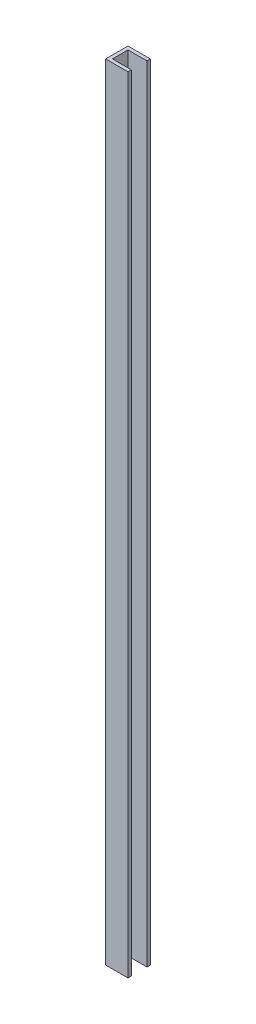
ISO-10303-21;
HEADER;
FILE_DESCRIPTION(('STEP AP214'),'2;1');
FILE_NAME('part.step','',(''),(''),'','','');
FILE_SCHEMA(('AUTOMOTIVE_DESIGN { 1 0 10303 214 1 1 1 1 }'));
ENDSEC;
DATA;
#1=APPLICATION_CONTEXT('core data for automotive mechanical design processes');
#2=APPLICATION_PROTOCOL_DEFINITION('international standard','automotive_design',2000,#1);
#3=PRODUCT_CONTEXT('',#1,'mechanical');
#4=PRODUCT('Part','Part','',(#3));
#5=PRODUCT_RELATED_PRODUCT_CATEGORY('part','',(#4));
#6=PRODUCT_DEFINITION_FORMATION('','',#4);
#7=PRODUCT_DEFINITION_CONTEXT('part definition',#1,'design');
#8=PRODUCT_DEFINITION('design','',#6,#7);
#9=PRODUCT_DEFINITION_SHAPE('','',#8);
#10=(LENGTH_UNIT() NAMED_UNIT(*) SI_UNIT(.MILLI.,.METRE.));
#11=(NAMED_UNIT(*) PLANE_ANGLE_UNIT() SI_UNIT($,.RADIAN.));
#12=(NAMED_UNIT(*) SI_UNIT($,.STERADIAN.) SOLID_ANGLE_UNIT());
#13=UNCERTAINTY_MEASURE_WITH_UNIT(LENGTH_MEASURE(1.E-05),#10,'distance_accuracy_value','');
#14=(GEOMETRIC_REPRESENTATION_CONTEXT(3) GLOBAL_UNCERTAINTY_ASSIGNED_CONTEXT((#13)) GLOBAL_UNIT_ASSIGNED_CONTEXT((#10,
#11,#12)) REPRESENTATION_CONTEXT('',''));
#15=CARTESIAN_POINT('',(0.,0.,0.));
#16=DIRECTION('',(0.,0.,1.));
#17=DIRECTION('',(1.,0.,0.));
#18=AXIS2_PLACEMENT_3D('',#15,#16,#17);
#19=CARTESIAN_POINT('',(-3.5,176.,0.));
#20=DIRECTION('',(1.,0.,0.));
#21=DIRECTION('',(0.,0.,-1.));
#22=AXIS2_PLACEMENT_3D('',#19,#20,#21);
#23=PLANE('',#22);
#24=DIRECTION('',(0.,0.,1.));
#25=VECTOR('',#24,1.);
#26=CARTESIAN_POINT('',(-3.5,-176.,0.));
#27=LINE('',#26,#25);
#28=CARTESIAN_POINT('',(-3.5,-176.,-3.50000000000002));
#29=VERTEX_POINT('',#28);
#30=CARTESIAN_POINT('',(-3.5,-176.,3.50000000000001));
#31=VERTEX_POINT('',#30);
#32=EDGE_CURVE('E197',#29,#31,#27,.T.);
#33=ORIENTED_EDGE('',*,*,#32,.F.);
#34=DIRECTION('',(0.,-1.,0.));
#35=VECTOR('',#34,1.);
#36=CARTESIAN_POINT('',(-3.5,176.,-3.50000000000002));
#37=LINE('',#36,#35);
#38=CARTESIAN_POINT('',(-3.5,176.,-3.50000000000002));
#39=VERTEX_POINT('',#38);
#40=EDGE_CURVE('E11',#39,#29,#37,.T.);
#41=ORIENTED_EDGE('',*,*,#40,.F.);
#42=DIRECTION('',(0.,0.,1.));
#43=VECTOR('',#42,1.);
#44=CARTESIAN_POINT('',(-3.5,176.,0.));
#45=LINE('',#44,#43);
#46=CARTESIAN_POINT('',(-3.5,176.,3.50000000000001));
#47=VERTEX_POINT('',#46);
#48=EDGE_CURVE('E153',#39,#47,#45,.T.);
#49=ORIENTED_EDGE('',*,*,#48,.T.);
#50=DIRECTION('',(0.,-1.,0.));
#51=VECTOR('',#50,1.);
#52=CARTESIAN_POINT('',(-3.5,176.,3.50000000000001));
#53=LINE('',#52,#51);
#54=EDGE_CURVE('E97',#47,#31,#53,.T.);
#55=ORIENTED_EDGE('',*,*,#54,.T.);
#56=EDGE_LOOP('',(#33,#41,#49,#55));
#57=FACE_BOUND('',#56,.T.);
#58=ADVANCED_FACE('F45',(#57),#23,.T.);
#59=CARTESIAN_POINT('',(0.,176.,-3.50000000000002));
#60=DIRECTION('',(0.,0.,1.));
#61=DIRECTION('',(1.,0.,0.));
#62=AXIS2_PLACEMENT_3D('',#59,#60,#61);
#63=PLANE('',#62);
#64=DIRECTION('',(-1.,0.,0.));
#65=VECTOR('',#64,1.);
#66=CARTESIAN_POINT('',(0.,-176.,-3.50000000000002));
#67=LINE('',#66,#65);
#68=CARTESIAN_POINT('',(5.,-176.,-3.50000000000002));
#69=VERTEX_POINT('',#68);
#70=EDGE_CURVE('E190',#69,#29,#67,.T.);
#71=ORIENTED_EDGE('',*,*,#70,.F.);
#72=DIRECTION('',(0.,-1.,0.));
#73=VECTOR('',#72,1.);
#74=CARTESIAN_POINT('',(5.,176.,-3.50000000000002));
#75=LINE('',#74,#73);
#76=CARTESIAN_POINT('',(5.,176.,-3.50000000000002));
#77=VERTEX_POINT('',#76);
#78=EDGE_CURVE('E54',#77,#69,#75,.T.);
#79=ORIENTED_EDGE('',*,*,#78,.F.);
#80=DIRECTION('',(-1.,0.,0.));
#81=VECTOR('',#80,1.);
#82=CARTESIAN_POINT('',(0.,176.,-3.50000000000002));
#83=LINE('',#82,#81);
#84=EDGE_CURVE('E145',#77,#39,#83,.T.);
#85=ORIENTED_EDGE('',*,*,#84,.T.);
#86=ORIENTED_EDGE('',*,*,#40,.T.);
#87=EDGE_LOOP('',(#71,#79,#85,#86));
#88=FACE_BOUND('',#87,.T.);
#89=ADVANCED_FACE('F195',(#88),#63,.T.);
#90=CARTESIAN_POINT('',(5.,176.,0.));
#91=DIRECTION('',(-1.,0.,0.));
#92=DIRECTION('',(0.,0.,1.));
#93=AXIS2_PLACEMENT_3D('',#90,#91,#92);
#94=PLANE('',#93);
#95=DIRECTION('',(0.,0.,-1.));
#96=VECTOR('',#95,1.);
#97=CARTESIAN_POINT('',(5.,-176.,0.));
#98=LINE('',#97,#96);
#99=CARTESIAN_POINT('',(5.,-176.,-5.00000000000002));
#100=VERTEX_POINT('',#99);
#101=EDGE_CURVE('E165',#69,#100,#98,.T.);
#102=ORIENTED_EDGE('',*,*,#101,.T.);
#103=DIRECTION('',(0.,-1.,0.));
#104=VECTOR('',#103,1.);
#105=CARTESIAN_POINT('',(5.,176.,-5.00000000000002));
#106=LINE('',#105,#104);
#107=CARTESIAN_POINT('',(5.,176.,-5.00000000000002));
#108=VERTEX_POINT('',#107);
#109=EDGE_CURVE('E178',#108,#100,#106,.T.);
#110=ORIENTED_EDGE('',*,*,#109,.F.);
#111=DIRECTION('',(0.,0.,-1.));
#112=VECTOR('',#111,1.);
#113=CARTESIAN_POINT('',(5.,176.,0.));
#114=LINE('',#113,#112);
#115=EDGE_CURVE('E138',#77,#108,#114,.T.);
#116=ORIENTED_EDGE('',*,*,#115,.F.);
#117=ORIENTED_EDGE('',*,*,#78,.T.);
#118=EDGE_LOOP('',(#102,#110,#116,#117));
#119=FACE_BOUND('',#118,.T.);
#120=ADVANCED_FACE('F184',(#119),#94,.F.);
#121=CARTESIAN_POINT('',(0.,176.,-5.00000000000002));
#122=DIRECTION('',(0.,0.,-1.));
#123=DIRECTION('',(-1.,0.,0.));
#124=AXIS2_PLACEMENT_3D('',#121,#122,#123);
#125=PLANE('',#124);
#126=DIRECTION('',(1.,0.,0.));
#127=VECTOR('',#126,1.);
#128=CARTESIAN_POINT('',(0.,-176.,-5.00000000000002));
#129=LINE('',#128,#127);
#130=CARTESIAN_POINT('',(-5.,-176.,-5.00000000000002));
#131=VERTEX_POINT('',#130);
#132=EDGE_CURVE('E193',#131,#100,#129,.T.);
#133=ORIENTED_EDGE('',*,*,#132,.F.);
#134=DIRECTION('',(0.,-1.,0.));
#135=VECTOR('',#134,1.);
#136=CARTESIAN_POINT('',(-5.,176.,-5.00000000000002));
#137=LINE('',#136,#135);
#138=CARTESIAN_POINT('',(-5.,176.,-5.00000000000002));
#139=VERTEX_POINT('',#138);
#140=EDGE_CURVE('E175',#139,#131,#137,.T.);
#141=ORIENTED_EDGE('',*,*,#140,.F.);
#142=DIRECTION('',(1.,0.,0.));
#143=VECTOR('',#142,1.);
#144=CARTESIAN_POINT('',(0.,176.,-5.00000000000002));
#145=LINE('',#144,#143);
#146=EDGE_CURVE('E144',#139,#108,#145,.T.);
#147=ORIENTED_EDGE('',*,*,#146,.T.);
#148=ORIENTED_EDGE('',*,*,#109,.T.);
#149=EDGE_LOOP('',(#133,#141,#147,#148));
#150=FACE_BOUND('',#149,.T.);
#151=ADVANCED_FACE('F210',(#150),#125,.T.);
#152=CARTESIAN_POINT('',(-5.,176.,0.));
#153=DIRECTION('',(-1.,0.,0.));
#154=DIRECTION('',(0.,0.,1.));
#155=AXIS2_PLACEMENT_3D('',#152,#153,#154);
#156=PLANE('',#155);
#157=DIRECTION('',(0.,0.,-1.));
#158=VECTOR('',#157,1.);
#159=CARTESIAN_POINT('',(-5.,-176.,0.));
#160=LINE('',#159,#158);
#161=CARTESIAN_POINT('',(-5.,-176.,5.00000000000002));
#162=VERTEX_POINT('',#161);
#163=EDGE_CURVE('E203',#162,#131,#160,.T.);
#164=ORIENTED_EDGE('',*,*,#163,.F.);
#165=DIRECTION('',(0.,-1.,0.));
#166=VECTOR('',#165,1.);
#167=CARTESIAN_POINT('',(-5.,176.,5.00000000000002));
#168=LINE('',#167,#166);
#169=CARTESIAN_POINT('',(-5.,176.,5.00000000000002));
#170=VERTEX_POINT('',#169);
#171=EDGE_CURVE('E132',#170,#162,#168,.T.);
#172=ORIENTED_EDGE('',*,*,#171,.F.);
#173=DIRECTION('',(0.,0.,-1.));
#174=VECTOR('',#173,1.);
#175=CARTESIAN_POINT('',(-5.,176.,0.));
#176=LINE('',#175,#174);
#177=EDGE_CURVE('E123',#170,#139,#176,.T.);
#178=ORIENTED_EDGE('',*,*,#177,.T.);
#179=ORIENTED_EDGE('',*,*,#140,.T.);
#180=EDGE_LOOP('',(#164,#172,#178,#179));
#181=FACE_BOUND('',#180,.T.);
#182=ADVANCED_FACE('F208',(#181),#156,.T.);
#183=CARTESIAN_POINT('',(0.,176.,5.00000000000002));
#184=DIRECTION('',(0.,0.,-1.));
#185=DIRECTION('',(-1.,0.,0.));
#186=AXIS2_PLACEMENT_3D('',#183,#184,#185);
#187=PLANE('',#186);
#188=DIRECTION('',(1.,0.,0.));
#189=VECTOR('',#188,1.);
#190=CARTESIAN_POINT('',(0.,-176.,5.00000000000002));
#191=LINE('',#190,#189);
#192=CARTESIAN_POINT('',(5.,-176.,5.00000000000002));
#193=VERTEX_POINT('',#192);
#194=EDGE_CURVE('E130',#162,#193,#191,.T.);
#195=ORIENTED_EDGE('',*,*,#194,.T.);
#196=DIRECTION('',(0.,-1.,0.));
#197=VECTOR('',#196,1.);
#198=CARTESIAN_POINT('',(5.,176.,5.00000000000002));
#199=LINE('',#198,#197);
#200=CARTESIAN_POINT('',(5.,176.,5.00000000000002));
#201=VERTEX_POINT('',#200);
#202=EDGE_CURVE('E127',#201,#193,#199,.T.);
#203=ORIENTED_EDGE('',*,*,#202,.F.);
#204=DIRECTION('',(1.,0.,0.));
#205=VECTOR('',#204,1.);
#206=CARTESIAN_POINT('',(0.,176.,5.00000000000002));
#207=LINE('',#206,#205);
#208=EDGE_CURVE('E116',#170,#201,#207,.T.);
#209=ORIENTED_EDGE('',*,*,#208,.F.);
#210=ORIENTED_EDGE('',*,*,#171,.T.);
#211=EDGE_LOOP('',(#195,#203,#209,#210));
#212=FACE_BOUND('',#211,.T.);
#213=ADVANCED_FACE('F128',(#212),#187,.F.);
#214=CARTESIAN_POINT('',(5.,-176.,3.50000000000001));
#215=VERTEX_POINT('',#214);
#216=EDGE_CURVE('E90',#193,#215,#98,.T.);
#217=ORIENTED_EDGE('',*,*,#216,.T.);
#218=DIRECTION('',(0.,-1.,0.));
#219=VECTOR('',#218,1.);
#220=CARTESIAN_POINT('',(5.,176.,3.50000000000001));
#221=LINE('',#220,#219);
#222=CARTESIAN_POINT('',(5.,176.,3.50000000000001));
#223=VERTEX_POINT('',#222);
#224=EDGE_CURVE('E133',#223,#215,#221,.T.);
#225=ORIENTED_EDGE('',*,*,#224,.F.);
#226=EDGE_CURVE('E120',#201,#223,#114,.T.);
#227=ORIENTED_EDGE('',*,*,#226,.F.);
#228=ORIENTED_EDGE('',*,*,#202,.T.);
#229=EDGE_LOOP('',(#217,#225,#227,#228));
#230=FACE_BOUND('',#229,.T.);
#231=ADVANCED_FACE('F135',(#230),#94,.F.);
#232=CARTESIAN_POINT('',(0.,176.,3.50000000000001));
#233=DIRECTION('',(0.,0.,1.));
#234=DIRECTION('',(1.,0.,0.));
#235=AXIS2_PLACEMENT_3D('',#232,#233,#234);
#236=PLANE('',#235);
#237=DIRECTION('',(-1.,0.,0.));
#238=VECTOR('',#237,1.);
#239=CARTESIAN_POINT('',(0.,-176.,3.50000000000001));
#240=LINE('',#239,#238);
#241=EDGE_CURVE('E156',#215,#31,#240,.T.);
#242=ORIENTED_EDGE('',*,*,#241,.T.);
#243=ORIENTED_EDGE('',*,*,#54,.F.);
#244=DIRECTION('',(-1.,0.,0.));
#245=VECTOR('',#244,1.);
#246=CARTESIAN_POINT('',(0.,176.,3.50000000000001));
#247=LINE('',#246,#245);
#248=EDGE_CURVE('E62',#223,#47,#247,.T.);
#249=ORIENTED_EDGE('',*,*,#248,.F.);
#250=ORIENTED_EDGE('',*,*,#224,.T.);
#251=EDGE_LOOP('',(#242,#243,#249,#250));
#252=FACE_BOUND('',#251,.T.);
#253=ADVANCED_FACE('F260',(#252),#236,.F.);
#254=CARTESIAN_POINT('',(0.,176.,0.));
#255=DIRECTION('',(0.,1.,0.));
#256=DIRECTION('',(0.,0.,1.));
#257=AXIS2_PLACEMENT_3D('',#254,#255,#256);
#258=PLANE('',#257);
#259=ORIENTED_EDGE('',*,*,#48,.F.);
#260=ORIENTED_EDGE('',*,*,#84,.F.);
#261=ORIENTED_EDGE('',*,*,#115,.T.);
#262=ORIENTED_EDGE('',*,*,#146,.F.);
#263=ORIENTED_EDGE('',*,*,#177,.F.);
#264=ORIENTED_EDGE('',*,*,#208,.T.);
#265=ORIENTED_EDGE('',*,*,#226,.T.);
#266=ORIENTED_EDGE('',*,*,#248,.T.);
#267=EDGE_LOOP('',(#259,#260,#261,#262,#263,#264,#265,#266));
#268=FACE_BOUND('',#267,.T.);
#269=ADVANCED_FACE('F118',(#268),#258,.T.);
#270=CARTESIAN_POINT('',(0.,-176.,0.));
#271=DIRECTION('',(0.,1.,0.));
#272=DIRECTION('',(0.,0.,1.));
#273=AXIS2_PLACEMENT_3D('',#270,#271,#272);
#274=PLANE('',#273);
#275=ORIENTED_EDGE('',*,*,#32,.T.);
#276=ORIENTED_EDGE('',*,*,#241,.F.);
#277=ORIENTED_EDGE('',*,*,#216,.F.);
#278=ORIENTED_EDGE('',*,*,#194,.F.);
#279=ORIENTED_EDGE('',*,*,#163,.T.);
#280=ORIENTED_EDGE('',*,*,#132,.T.);
#281=ORIENTED_EDGE('',*,*,#101,.F.);
#282=ORIENTED_EDGE('',*,*,#70,.T.);
#283=EDGE_LOOP('',(#275,#276,#277,#278,#279,#280,#281,#282));
#284=FACE_BOUND('',#283,.T.);
#285=ADVANCED_FACE('F189',(#284),#274,.F.);
#286=CLOSED_SHELL('',(#58,#89,#120,#151,#182,#213,#231,#253,#269,#285));
#287=MANIFOLD_SOLID_BREP('B2',#286);
#288=ADVANCED_BREP_SHAPE_REPRESENTATION('',(#18,#287),#14);
#289=SHAPE_DEFINITION_REPRESENTATION(#9,#288);
ENDSEC;
END-ISO-10303-21;
